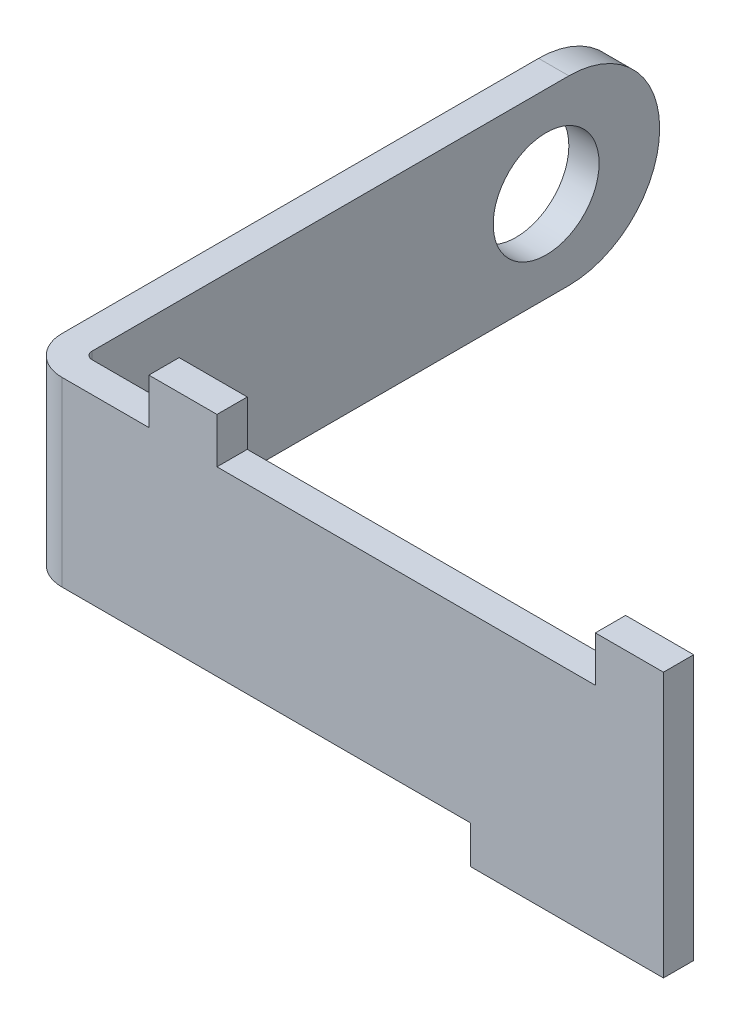
ISO-10303-21;
HEADER;
FILE_DESCRIPTION(('STEP AP214'),'2;1');
FILE_NAME('part.step','',(''),(''),'','','');
FILE_SCHEMA(('AUTOMOTIVE_DESIGN { 1 0 10303 214 1 1 1 1 }'));
ENDSEC;
DATA;
#1=APPLICATION_CONTEXT('core data for automotive mechanical design processes');
#2=APPLICATION_PROTOCOL_DEFINITION('international standard','automotive_design',2000,#1);
#3=PRODUCT_CONTEXT('',#1,'mechanical');
#4=PRODUCT('Part','Part','',(#3));
#5=PRODUCT_RELATED_PRODUCT_CATEGORY('part','',(#4));
#6=PRODUCT_DEFINITION_FORMATION('','',#4);
#7=PRODUCT_DEFINITION_CONTEXT('part definition',#1,'design');
#8=PRODUCT_DEFINITION('design','',#6,#7);
#9=PRODUCT_DEFINITION_SHAPE('','',#8);
#10=(LENGTH_UNIT() NAMED_UNIT(*) SI_UNIT(.MILLI.,.METRE.));
#11=(NAMED_UNIT(*) PLANE_ANGLE_UNIT() SI_UNIT($,.RADIAN.));
#12=(NAMED_UNIT(*) SI_UNIT($,.STERADIAN.) SOLID_ANGLE_UNIT());
#13=UNCERTAINTY_MEASURE_WITH_UNIT(LENGTH_MEASURE(1.E-05),#10,'distance_accuracy_value','');
#14=(GEOMETRIC_REPRESENTATION_CONTEXT(3) GLOBAL_UNCERTAINTY_ASSIGNED_CONTEXT((#13)) GLOBAL_UNIT_ASSIGNED_CONTEXT((#10,
#11,#12)) REPRESENTATION_CONTEXT('',''));
#15=CARTESIAN_POINT('',(0.,0.,0.));
#16=DIRECTION('',(0.,0.,1.));
#17=DIRECTION('',(1.,0.,0.));
#18=AXIS2_PLACEMENT_3D('',#15,#16,#17);
#19=CARTESIAN_POINT('',(-2.575,1.2,0.4));
#20=DIRECTION('',(0.,-1.,0.));
#21=DIRECTION('',(1.,0.,0.));
#22=AXIS2_PLACEMENT_3D('',#19,#20,#21);
#23=PLANE('',#22);
#24=DIRECTION('',(0.,0.,1.));
#25=VECTOR('',#24,1.);
#26=CARTESIAN_POINT('',(-2.575,1.2,0.4));
#27=LINE('',#26,#25);
#28=CARTESIAN_POINT('',(-2.575,1.2,0.));
#29=VERTEX_POINT('',#28);
#30=CARTESIAN_POINT('',(-2.575,1.2,0.4));
#31=VERTEX_POINT('',#30);
#32=EDGE_CURVE('E151',#29,#31,#27,.T.);
#33=ORIENTED_EDGE('',*,*,#32,.F.);
#34=DIRECTION('',(1.,0.,0.));
#35=VECTOR('',#34,1.);
#36=CARTESIAN_POINT('',(-2.575,1.2,0.));
#37=LINE('',#36,#35);
#38=CARTESIAN_POINT('',(-3.725,1.2,0.));
#39=VERTEX_POINT('',#38);
#40=EDGE_CURVE('E135',#39,#29,#37,.T.);
#41=ORIENTED_EDGE('',*,*,#40,.F.);
#42=CARTESIAN_POINT('',(-3.725,1.2,-0.1));
#43=DIRECTION('',(0.,1.,0.));
#44=DIRECTION('',(0.,0.,1.));
#45=AXIS2_PLACEMENT_3D('',#42,#43,#44);
#46=CIRCLE('',#45,0.1);
#47=CARTESIAN_POINT('',(-3.82499999999998,1.2,-0.1));
#48=VERTEX_POINT('',#47);
#49=EDGE_CURVE('E185',#39,#48,#46,.F.);
#50=ORIENTED_EDGE('',*,*,#49,.T.);
#51=DIRECTION('',(0.,0.,1.));
#52=VECTOR('',#51,1.);
#53=CARTESIAN_POINT('',(-3.825,1.2,-6.4));
#54=LINE('',#53,#52);
#55=CARTESIAN_POINT('',(-3.825,1.19999999999999,-6.4));
#56=VERTEX_POINT('',#55);
#57=EDGE_CURVE('E182',#48,#56,#54,.F.);
#58=ORIENTED_EDGE('',*,*,#57,.T.);
#59=DIRECTION('',(1.,0.,0.));
#60=VECTOR('',#59,1.);
#61=CARTESIAN_POINT('',(-4.225,1.19999999999999,-6.4));
#62=LINE('',#61,#60);
#63=CARTESIAN_POINT('',(-4.225,1.19999999999999,-6.4));
#64=VERTEX_POINT('',#63);
#65=EDGE_CURVE('E150',#64,#56,#62,.T.);
#66=ORIENTED_EDGE('',*,*,#65,.F.);
#67=DIRECTION('',(0.,0.,1.));
#68=VECTOR('',#67,1.);
#69=CARTESIAN_POINT('',(-4.225,1.2,-6.4));
#70=LINE('',#69,#68);
#71=CARTESIAN_POINT('',(-4.22499999999999,1.2,-0.0999999999999992));
#72=VERTEX_POINT('',#71);
#73=EDGE_CURVE('E132',#72,#64,#70,.F.);
#74=ORIENTED_EDGE('',*,*,#73,.F.);
#75=CARTESIAN_POINT('',(-3.725,1.2,-0.1));
#76=DIRECTION('',(0.,1.,0.));
#77=DIRECTION('',(0.,0.,1.));
#78=AXIS2_PLACEMENT_3D('',#75,#76,#77);
#79=CIRCLE('',#78,0.5);
#80=CARTESIAN_POINT('',(-3.725,1.2,0.4));
#81=VERTEX_POINT('',#80);
#82=EDGE_CURVE('E19',#81,#72,#79,.F.);
#83=ORIENTED_EDGE('',*,*,#82,.F.);
#84=DIRECTION('',(1.,0.,0.));
#85=VECTOR('',#84,1.);
#86=CARTESIAN_POINT('',(-2.575,1.2,0.4));
#87=LINE('',#86,#85);
#88=EDGE_CURVE('E128',#31,#81,#87,.F.);
#89=ORIENTED_EDGE('',*,*,#88,.F.);
#90=EDGE_LOOP('',(#33,#41,#50,#58,#66,#74,#83,#89));
#91=FACE_BOUND('',#90,.T.);
#92=ADVANCED_FACE('F16',(#91),#23,.F.);
#93=CARTESIAN_POINT('',(-4.225,0.,-6.4));
#94=DIRECTION('',(1.,0.,0.));
#95=DIRECTION('',(0.,0.,-1.));
#96=AXIS2_PLACEMENT_3D('',#93,#94,#95);
#97=CYLINDRICAL_SURFACE('',#96,1.2);
#98=CARTESIAN_POINT('',(-3.825,0.,-6.4));
#99=DIRECTION('',(1.,0.,0.));
#100=DIRECTION('',(0.,0.,-1.));
#101=AXIS2_PLACEMENT_3D('',#98,#99,#100);
#102=CIRCLE('',#101,1.2);
#103=CARTESIAN_POINT('',(-3.825,-1.20000000000001,-6.4));
#104=VERTEX_POINT('',#103);
#105=EDGE_CURVE('E179',#56,#104,#102,.F.);
#106=ORIENTED_EDGE('',*,*,#105,.T.);
#107=DIRECTION('',(1.,0.,0.));
#108=VECTOR('',#107,1.);
#109=CARTESIAN_POINT('',(-4.225,-1.20000000000001,-6.4));
#110=LINE('',#109,#108);
#111=CARTESIAN_POINT('',(-4.225,-1.20000000000001,-6.4));
#112=VERTEX_POINT('',#111);
#113=EDGE_CURVE('E154',#104,#112,#110,.F.);
#114=ORIENTED_EDGE('',*,*,#113,.T.);
#115=CARTESIAN_POINT('',(-4.225,0.,-6.4));
#116=DIRECTION('',(1.,0.,0.));
#117=DIRECTION('',(0.,0.,-1.));
#118=AXIS2_PLACEMENT_3D('',#115,#116,#117);
#119=CIRCLE('',#118,1.2);
#120=EDGE_CURVE('E173',#64,#112,#119,.F.);
#121=ORIENTED_EDGE('',*,*,#120,.F.);
#122=ORIENTED_EDGE('',*,*,#65,.T.);
#123=EDGE_LOOP('',(#106,#114,#121,#122));
#124=FACE_BOUND('',#123,.T.);
#125=ADVANCED_FACE('F374',(#124),#97,.T.);
#126=CARTESIAN_POINT('',(-4.225,0.,-6.1));
#127=DIRECTION('',(1.,0.,0.));
#128=DIRECTION('',(0.,0.,-1.));
#129=AXIS2_PLACEMENT_3D('',#126,#127,#128);
#130=CYLINDRICAL_SURFACE('',#129,0.7);
#131=CARTESIAN_POINT('',(-3.825,0.,-6.1));
#132=DIRECTION('',(1.,0.,0.));
#133=DIRECTION('',(0.,0.,-1.));
#134=AXIS2_PLACEMENT_3D('',#131,#132,#133);
#135=CIRCLE('',#134,0.7);
#136=CARTESIAN_POINT('',(-3.825,0.,-6.8));
#137=VERTEX_POINT('',#136);
#138=EDGE_CURVE('E176',#137,#137,#135,.T.);
#139=ORIENTED_EDGE('',*,*,#138,.T.);
#140=EDGE_LOOP('',(#139));
#141=FACE_BOUND('',#140,.T.);
#142=CARTESIAN_POINT('',(-4.225,0.,-6.1));
#143=DIRECTION('',(1.,0.,0.));
#144=DIRECTION('',(0.,0.,-1.));
#145=AXIS2_PLACEMENT_3D('',#142,#143,#144);
#146=CIRCLE('',#145,0.7);
#147=CARTESIAN_POINT('',(-4.225,0.,-6.8));
#148=VERTEX_POINT('',#147);
#149=EDGE_CURVE('E169',#148,#148,#146,.T.);
#150=ORIENTED_EDGE('',*,*,#149,.F.);
#151=EDGE_LOOP('',(#150));
#152=FACE_BOUND('',#151,.T.);
#153=ADVANCED_FACE('F512',(#141,#152),#130,.F.);
#154=CARTESIAN_POINT('',(-3.725,1.2,-0.1));
#155=DIRECTION('',(0.,1.,0.));
#156=DIRECTION('',(0.,0.,1.));
#157=AXIS2_PLACEMENT_3D('',#154,#155,#156);
#158=CYLINDRICAL_SURFACE('',#157,0.1);
#159=DIRECTION('',(0.,1.,0.));
#160=VECTOR('',#159,1.);
#161=CARTESIAN_POINT('',(-3.82499999999998,0.,-0.1));
#162=LINE('',#161,#160);
#163=CARTESIAN_POINT('',(-3.82499999999999,-1.2,-0.1));
#164=VERTEX_POINT('',#163);
#165=EDGE_CURVE('E184',#164,#48,#162,.T.);
#166=ORIENTED_EDGE('',*,*,#165,.T.);
#167=ORIENTED_EDGE('',*,*,#49,.F.);
#168=DIRECTION('',(0.,1.,0.));
#169=VECTOR('',#168,1.);
#170=CARTESIAN_POINT('',(-3.725,-1.2,0.));
#171=LINE('',#170,#169);
#172=CARTESIAN_POINT('',(-3.725,-1.2,0.));
#173=VERTEX_POINT('',#172);
#174=EDGE_CURVE('E172',#173,#39,#171,.T.);
#175=ORIENTED_EDGE('',*,*,#174,.F.);
#176=CARTESIAN_POINT('',(-3.725,-1.2,-0.1));
#177=DIRECTION('',(0.,1.,0.));
#178=DIRECTION('',(0.,0.,1.));
#179=AXIS2_PLACEMENT_3D('',#176,#177,#178);
#180=CIRCLE('',#179,0.1);
#181=EDGE_CURVE('E183',#164,#173,#180,.T.);
#182=ORIENTED_EDGE('',*,*,#181,.F.);
#183=EDGE_LOOP('',(#166,#167,#175,#182));
#184=FACE_BOUND('',#183,.T.);
#185=ADVANCED_FACE('F369',(#184),#158,.F.);
#186=CARTESIAN_POINT('',(-3.825,0.,-6.4));
#187=DIRECTION('',(-1.,0.,0.));
#188=DIRECTION('',(0.,0.,1.));
#189=AXIS2_PLACEMENT_3D('',#186,#187,#188);
#190=PLANE('',#189);
#191=ORIENTED_EDGE('',*,*,#138,.F.);
#192=EDGE_LOOP('',(#191));
#193=FACE_BOUND('',#192,.T.);
#194=ORIENTED_EDGE('',*,*,#105,.F.);
#195=ORIENTED_EDGE('',*,*,#57,.F.);
#196=ORIENTED_EDGE('',*,*,#165,.F.);
#197=DIRECTION('',(0.,0.,1.));
#198=VECTOR('',#197,1.);
#199=CARTESIAN_POINT('',(-3.825,-1.2,0.4));
#200=LINE('',#199,#198);
#201=EDGE_CURVE('E321',#164,#104,#200,.F.);
#202=ORIENTED_EDGE('',*,*,#201,.T.);
#203=EDGE_LOOP('',(#194,#195,#196,#202));
#204=FACE_BOUND('',#203,.T.);
#205=ADVANCED_FACE('F372',(#193,#204),#190,.F.);
#206=CARTESIAN_POINT('',(-4.225,0.,-6.4));
#207=DIRECTION('',(-1.,0.,0.));
#208=DIRECTION('',(0.,0.,1.));
#209=AXIS2_PLACEMENT_3D('',#206,#207,#208);
#210=PLANE('',#209);
#211=ORIENTED_EDGE('',*,*,#149,.T.);
#212=EDGE_LOOP('',(#211));
#213=FACE_BOUND('',#212,.T.);
#214=DIRECTION('',(0.,0.,1.));
#215=VECTOR('',#214,1.);
#216=CARTESIAN_POINT('',(-4.225,-1.2,0.4));
#217=LINE('',#216,#215);
#218=CARTESIAN_POINT('',(-4.225,-1.2,-0.1));
#219=VERTEX_POINT('',#218);
#220=EDGE_CURVE('E168',#112,#219,#217,.T.);
#221=ORIENTED_EDGE('',*,*,#220,.T.);
#222=DIRECTION('',(0.,1.,0.));
#223=VECTOR('',#222,1.);
#224=CARTESIAN_POINT('',(-4.225,1.2,-0.1));
#225=LINE('',#224,#223);
#226=EDGE_CURVE('E197',#72,#219,#225,.F.);
#227=ORIENTED_EDGE('',*,*,#226,.F.);
#228=ORIENTED_EDGE('',*,*,#73,.T.);
#229=ORIENTED_EDGE('',*,*,#120,.T.);
#230=EDGE_LOOP('',(#221,#227,#228,#229));
#231=FACE_BOUND('',#230,.T.);
#232=ADVANCED_FACE('F376',(#213,#231),#210,.T.);
#233=CARTESIAN_POINT('',(1.675,-1.2,0.));
#234=DIRECTION('',(0.,0.,-1.));
#235=DIRECTION('',(-1.,0.,0.));
#236=AXIS2_PLACEMENT_3D('',#233,#234,#235);
#237=PLANE('',#236);
#238=DIRECTION('',(1.,0.,0.));
#239=VECTOR('',#238,1.);
#240=CARTESIAN_POINT('',(3.325,1.8,0.));
#241=LINE('',#240,#239);
#242=CARTESIAN_POINT('',(3.325,1.8,0.));
#243=VERTEX_POINT('',#242);
#244=CARTESIAN_POINT('',(4.225,1.8,0.));
#245=VERTEX_POINT('',#244);
#246=EDGE_CURVE('E223',#243,#245,#241,.T.);
#247=ORIENTED_EDGE('',*,*,#246,.T.);
#248=DIRECTION('',(0.,1.,0.));
#249=VECTOR('',#248,1.);
#250=CARTESIAN_POINT('',(4.225,1.8,0.));
#251=LINE('',#250,#249);
#252=CARTESIAN_POINT('',(4.225,-1.7,0.));
#253=VERTEX_POINT('',#252);
#254=EDGE_CURVE('E229',#245,#253,#251,.F.);
#255=ORIENTED_EDGE('',*,*,#254,.T.);
#256=DIRECTION('',(1.,0.,0.));
#257=VECTOR('',#256,1.);
#258=CARTESIAN_POINT('',(1.675,-1.7,0.));
#259=LINE('',#258,#257);
#260=CARTESIAN_POINT('',(1.675,-1.7,0.));
#261=VERTEX_POINT('',#260);
#262=EDGE_CURVE('E235',#253,#261,#259,.F.);
#263=ORIENTED_EDGE('',*,*,#262,.T.);
#264=DIRECTION('',(0.,1.,0.));
#265=VECTOR('',#264,1.);
#266=CARTESIAN_POINT('',(1.675,-1.2,0.));
#267=LINE('',#266,#265);
#268=CARTESIAN_POINT('',(1.675,-1.2,0.));
#269=VERTEX_POINT('',#268);
#270=EDGE_CURVE('E246',#261,#269,#267,.T.);
#271=ORIENTED_EDGE('',*,*,#270,.T.);
#272=DIRECTION('',(-1.,0.,0.));
#273=VECTOR('',#272,1.);
#274=CARTESIAN_POINT('',(-4.225,-1.2,0.));
#275=LINE('',#274,#273);
#276=EDGE_CURVE('E143',#269,#173,#275,.T.);
#277=ORIENTED_EDGE('',*,*,#276,.T.);
#278=ORIENTED_EDGE('',*,*,#174,.T.);
#279=ORIENTED_EDGE('',*,*,#40,.T.);
#280=DIRECTION('',(0.,1.,0.));
#281=VECTOR('',#280,1.);
#282=CARTESIAN_POINT('',(-2.575,1.2,0.));
#283=LINE('',#282,#281);
#284=CARTESIAN_POINT('',(-2.575,1.8,0.));
#285=VERTEX_POINT('',#284);
#286=EDGE_CURVE('E193',#29,#285,#283,.T.);
#287=ORIENTED_EDGE('',*,*,#286,.T.);
#288=DIRECTION('',(1.,0.,0.));
#289=VECTOR('',#288,1.);
#290=CARTESIAN_POINT('',(-2.575,1.8,0.));
#291=LINE('',#290,#289);
#292=CARTESIAN_POINT('',(-1.675,1.8,0.));
#293=VERTEX_POINT('',#292);
#294=EDGE_CURVE('E196',#285,#293,#291,.T.);
#295=ORIENTED_EDGE('',*,*,#294,.T.);
#296=DIRECTION('',(0.,1.,0.));
#297=VECTOR('',#296,1.);
#298=CARTESIAN_POINT('',(-1.675,1.2,0.));
#299=LINE('',#298,#297);
#300=CARTESIAN_POINT('',(-1.675,1.2,0.));
#301=VERTEX_POINT('',#300);
#302=EDGE_CURVE('E205',#293,#301,#299,.F.);
#303=ORIENTED_EDGE('',*,*,#302,.T.);
#304=DIRECTION('',(1.,0.,0.));
#305=VECTOR('',#304,1.);
#306=CARTESIAN_POINT('',(-1.675,1.2,0.));
#307=LINE('',#306,#305);
#308=CARTESIAN_POINT('',(3.325,1.2,0.));
#309=VERTEX_POINT('',#308);
#310=EDGE_CURVE('E211',#301,#309,#307,.T.);
#311=ORIENTED_EDGE('',*,*,#310,.T.);
#312=DIRECTION('',(0.,1.,0.));
#313=VECTOR('',#312,1.);
#314=CARTESIAN_POINT('',(3.325,1.2,0.));
#315=LINE('',#314,#313);
#316=EDGE_CURVE('E217',#309,#243,#315,.T.);
#317=ORIENTED_EDGE('',*,*,#316,.T.);
#318=EDGE_LOOP('',(#247,#255,#263,#271,#277,#278,#279,#287,#295,#303,#311,#317));
#319=FACE_BOUND('',#318,.T.);
#320=ADVANCED_FACE('F339',(#319),#237,.T.);
#321=CARTESIAN_POINT('',(-3.725,1.2,-0.1));
#322=DIRECTION('',(0.,1.,0.));
#323=DIRECTION('',(0.,0.,1.));
#324=AXIS2_PLACEMENT_3D('',#321,#322,#323);
#325=CYLINDRICAL_SURFACE('',#324,0.5);
#326=DIRECTION('',(0.,1.,0.));
#327=VECTOR('',#326,1.);
#328=CARTESIAN_POINT('',(-3.725,-1.2,0.4));
#329=LINE('',#328,#327);
#330=CARTESIAN_POINT('',(-3.725,-1.2,0.4));
#331=VERTEX_POINT('',#330);
#332=EDGE_CURVE('E137',#331,#81,#329,.T.);
#333=ORIENTED_EDGE('',*,*,#332,.T.);
#334=ORIENTED_EDGE('',*,*,#82,.T.);
#335=ORIENTED_EDGE('',*,*,#226,.T.);
#336=CARTESIAN_POINT('',(-3.725,-1.2,-0.1));
#337=DIRECTION('',(0.,1.,0.));
#338=DIRECTION('',(0.,0.,1.));
#339=AXIS2_PLACEMENT_3D('',#336,#337,#338);
#340=CIRCLE('',#339,0.5);
#341=EDGE_CURVE('E140',#219,#331,#340,.T.);
#342=ORIENTED_EDGE('',*,*,#341,.T.);
#343=EDGE_LOOP('',(#333,#334,#335,#342));
#344=FACE_BOUND('',#343,.T.);
#345=ADVANCED_FACE('F138',(#344),#325,.T.);
#346=CARTESIAN_POINT('',(-2.575,1.2,0.4));
#347=DIRECTION('',(1.,0.,0.));
#348=DIRECTION('',(0.,0.,-1.));
#349=AXIS2_PLACEMENT_3D('',#346,#347,#348);
#350=PLANE('',#349);
#351=DIRECTION('',(0.,1.,0.));
#352=VECTOR('',#351,1.);
#353=CARTESIAN_POINT('',(-2.575,-1.2,0.4));
#354=LINE('',#353,#352);
#355=CARTESIAN_POINT('',(-2.575,1.8,0.4));
#356=VERTEX_POINT('',#355);
#357=EDGE_CURVE('E142',#31,#356,#354,.T.);
#358=ORIENTED_EDGE('',*,*,#357,.T.);
#359=DIRECTION('',(0.,0.,-1.));
#360=VECTOR('',#359,1.);
#361=CARTESIAN_POINT('',(-2.575,1.8,0.4));
#362=LINE('',#361,#360);
#363=EDGE_CURVE('E202',#356,#285,#362,.T.);
#364=ORIENTED_EDGE('',*,*,#363,.T.);
#365=ORIENTED_EDGE('',*,*,#286,.F.);
#366=ORIENTED_EDGE('',*,*,#32,.T.);
#367=EDGE_LOOP('',(#358,#364,#365,#366));
#368=FACE_BOUND('',#367,.T.);
#369=ADVANCED_FACE('F367',(#368),#350,.F.);
#370=CARTESIAN_POINT('',(-2.575,1.8,0.4));
#371=DIRECTION('',(0.,-1.,0.));
#372=DIRECTION('',(0.,0.,-1.));
#373=AXIS2_PLACEMENT_3D('',#370,#371,#372);
#374=PLANE('',#373);
#375=DIRECTION('',(-1.,0.,0.));
#376=VECTOR('',#375,1.);
#377=CARTESIAN_POINT('',(1.675,1.8,0.4));
#378=LINE('',#377,#376);
#379=CARTESIAN_POINT('',(-1.675,1.8,0.4));
#380=VERTEX_POINT('',#379);
#381=EDGE_CURVE('E254',#356,#380,#378,.F.);
#382=ORIENTED_EDGE('',*,*,#381,.T.);
#383=DIRECTION('',(0.,0.,1.));
#384=VECTOR('',#383,1.);
#385=CARTESIAN_POINT('',(-1.675,1.8,0.4));
#386=LINE('',#385,#384);
#387=EDGE_CURVE('E208',#380,#293,#386,.F.);
#388=ORIENTED_EDGE('',*,*,#387,.T.);
#389=ORIENTED_EDGE('',*,*,#294,.F.);
#390=ORIENTED_EDGE('',*,*,#363,.F.);
#391=EDGE_LOOP('',(#382,#388,#389,#390));
#392=FACE_BOUND('',#391,.T.);
#393=ADVANCED_FACE('F364',(#392),#374,.F.);
#394=CARTESIAN_POINT('',(-1.675,1.2,0.4));
#395=DIRECTION('',(-1.,0.,0.));
#396=DIRECTION('',(0.,0.,1.));
#397=AXIS2_PLACEMENT_3D('',#394,#395,#396);
#398=PLANE('',#397);
#399=DIRECTION('',(0.,1.,0.));
#400=VECTOR('',#399,1.);
#401=CARTESIAN_POINT('',(-1.675,-1.2,0.4));
#402=LINE('',#401,#400);
#403=CARTESIAN_POINT('',(-1.675,1.2,0.4));
#404=VERTEX_POINT('',#403);
#405=EDGE_CURVE('E263',#380,#404,#402,.F.);
#406=ORIENTED_EDGE('',*,*,#405,.T.);
#407=DIRECTION('',(0.,0.,-1.));
#408=VECTOR('',#407,1.);
#409=CARTESIAN_POINT('',(-1.675,1.2,0.4));
#410=LINE('',#409,#408);
#411=EDGE_CURVE('E214',#404,#301,#410,.T.);
#412=ORIENTED_EDGE('',*,*,#411,.T.);
#413=ORIENTED_EDGE('',*,*,#302,.F.);
#414=ORIENTED_EDGE('',*,*,#387,.F.);
#415=EDGE_LOOP('',(#406,#412,#413,#414));
#416=FACE_BOUND('',#415,.T.);
#417=ADVANCED_FACE('F362',(#416),#398,.F.);
#418=CARTESIAN_POINT('',(-1.675,1.2,0.4));
#419=DIRECTION('',(0.,-1.,0.));
#420=DIRECTION('',(0.,0.,-1.));
#421=AXIS2_PLACEMENT_3D('',#418,#419,#420);
#422=PLANE('',#421);
#423=DIRECTION('',(-1.,0.,0.));
#424=VECTOR('',#423,1.);
#425=CARTESIAN_POINT('',(1.675,1.2,0.4));
#426=LINE('',#425,#424);
#427=CARTESIAN_POINT('',(3.325,1.2,0.4));
#428=VERTEX_POINT('',#427);
#429=EDGE_CURVE('E272',#404,#428,#426,.F.);
#430=ORIENTED_EDGE('',*,*,#429,.T.);
#431=DIRECTION('',(0.,0.,-1.));
#432=VECTOR('',#431,1.);
#433=CARTESIAN_POINT('',(3.325,1.2,0.4));
#434=LINE('',#433,#432);
#435=EDGE_CURVE('E220',#428,#309,#434,.T.);
#436=ORIENTED_EDGE('',*,*,#435,.T.);
#437=ORIENTED_EDGE('',*,*,#310,.F.);
#438=ORIENTED_EDGE('',*,*,#411,.F.);
#439=EDGE_LOOP('',(#430,#436,#437,#438));
#440=FACE_BOUND('',#439,.T.);
#441=ADVANCED_FACE('F360',(#440),#422,.F.);
#442=CARTESIAN_POINT('',(3.325,1.2,0.4));
#443=DIRECTION('',(1.,0.,0.));
#444=DIRECTION('',(0.,0.,-1.));
#445=AXIS2_PLACEMENT_3D('',#442,#443,#444);
#446=PLANE('',#445);
#447=DIRECTION('',(0.,1.,0.));
#448=VECTOR('',#447,1.);
#449=CARTESIAN_POINT('',(3.325,-1.2,0.4));
#450=LINE('',#449,#448);
#451=CARTESIAN_POINT('',(3.325,1.8,0.4));
#452=VERTEX_POINT('',#451);
#453=EDGE_CURVE('E281',#428,#452,#450,.T.);
#454=ORIENTED_EDGE('',*,*,#453,.T.);
#455=DIRECTION('',(0.,0.,-1.));
#456=VECTOR('',#455,1.);
#457=CARTESIAN_POINT('',(3.325,1.8,0.4));
#458=LINE('',#457,#456);
#459=EDGE_CURVE('E226',#452,#243,#458,.T.);
#460=ORIENTED_EDGE('',*,*,#459,.T.);
#461=ORIENTED_EDGE('',*,*,#316,.F.);
#462=ORIENTED_EDGE('',*,*,#435,.F.);
#463=EDGE_LOOP('',(#454,#460,#461,#462));
#464=FACE_BOUND('',#463,.T.);
#465=ADVANCED_FACE('F356',(#464),#446,.F.);
#466=CARTESIAN_POINT('',(3.325,1.8,0.4));
#467=DIRECTION('',(0.,-1.,0.));
#468=DIRECTION('',(0.,0.,-1.));
#469=AXIS2_PLACEMENT_3D('',#466,#467,#468);
#470=PLANE('',#469);
#471=DIRECTION('',(-1.,0.,0.));
#472=VECTOR('',#471,1.);
#473=CARTESIAN_POINT('',(1.675,1.8,0.4));
#474=LINE('',#473,#472);
#475=CARTESIAN_POINT('',(4.225,1.8,0.4));
#476=VERTEX_POINT('',#475);
#477=EDGE_CURVE('E290',#452,#476,#474,.F.);
#478=ORIENTED_EDGE('',*,*,#477,.T.);
#479=DIRECTION('',(0.,0.,1.));
#480=VECTOR('',#479,1.);
#481=CARTESIAN_POINT('',(4.225,1.8,0.4));
#482=LINE('',#481,#480);
#483=EDGE_CURVE('E232',#476,#245,#482,.F.);
#484=ORIENTED_EDGE('',*,*,#483,.T.);
#485=ORIENTED_EDGE('',*,*,#246,.F.);
#486=ORIENTED_EDGE('',*,*,#459,.F.);
#487=EDGE_LOOP('',(#478,#484,#485,#486));
#488=FACE_BOUND('',#487,.T.);
#489=ADVANCED_FACE('F354',(#488),#470,.F.);
#490=CARTESIAN_POINT('',(4.225,1.8,0.4));
#491=DIRECTION('',(-1.,0.,0.));
#492=DIRECTION('',(0.,0.,1.));
#493=AXIS2_PLACEMENT_3D('',#490,#491,#492);
#494=PLANE('',#493);
#495=DIRECTION('',(0.,1.,0.));
#496=VECTOR('',#495,1.);
#497=CARTESIAN_POINT('',(4.225,-1.2,0.4));
#498=LINE('',#497,#496);
#499=CARTESIAN_POINT('',(4.225,-1.7,0.4));
#500=VERTEX_POINT('',#499);
#501=EDGE_CURVE('E299',#476,#500,#498,.F.);
#502=ORIENTED_EDGE('',*,*,#501,.T.);
#503=DIRECTION('',(0.,0.,1.));
#504=VECTOR('',#503,1.);
#505=CARTESIAN_POINT('',(4.225,-1.7,0.4));
#506=LINE('',#505,#504);
#507=EDGE_CURVE('E238',#500,#253,#506,.F.);
#508=ORIENTED_EDGE('',*,*,#507,.T.);
#509=ORIENTED_EDGE('',*,*,#254,.F.);
#510=ORIENTED_EDGE('',*,*,#483,.F.);
#511=EDGE_LOOP('',(#502,#508,#509,#510));
#512=FACE_BOUND('',#511,.T.);
#513=ADVANCED_FACE('F350',(#512),#494,.F.);
#514=CARTESIAN_POINT('',(1.675,-1.7,0.4));
#515=DIRECTION('',(0.,1.,0.));
#516=DIRECTION('',(0.,0.,1.));
#517=AXIS2_PLACEMENT_3D('',#514,#515,#516);
#518=PLANE('',#517);
#519=DIRECTION('',(-1.,0.,0.));
#520=VECTOR('',#519,1.);
#521=CARTESIAN_POINT('',(1.675,-1.7,0.4));
#522=LINE('',#521,#520);
#523=CARTESIAN_POINT('',(1.675,-1.7,0.4));
#524=VERTEX_POINT('',#523);
#525=EDGE_CURVE('E308',#500,#524,#522,.T.);
#526=ORIENTED_EDGE('',*,*,#525,.T.);
#527=DIRECTION('',(0.,0.,-1.));
#528=VECTOR('',#527,1.);
#529=CARTESIAN_POINT('',(1.675,-1.7,0.4));
#530=LINE('',#529,#528);
#531=EDGE_CURVE('E248',#524,#261,#530,.T.);
#532=ORIENTED_EDGE('',*,*,#531,.T.);
#533=ORIENTED_EDGE('',*,*,#262,.F.);
#534=ORIENTED_EDGE('',*,*,#507,.F.);
#535=EDGE_LOOP('',(#526,#532,#533,#534));
#536=FACE_BOUND('',#535,.T.);
#537=ADVANCED_FACE('F348',(#536),#518,.F.);
#538=CARTESIAN_POINT('',(1.675,-1.2,0.4));
#539=DIRECTION('',(1.,0.,0.));
#540=DIRECTION('',(0.,0.,-1.));
#541=AXIS2_PLACEMENT_3D('',#538,#539,#540);
#542=PLANE('',#541);
#543=DIRECTION('',(0.,1.,0.));
#544=VECTOR('',#543,1.);
#545=CARTESIAN_POINT('',(1.675,-1.2,0.4));
#546=LINE('',#545,#544);
#547=CARTESIAN_POINT('',(1.675,-1.2,0.4));
#548=VERTEX_POINT('',#547);
#549=EDGE_CURVE('E25',#524,#548,#546,.T.);
#550=ORIENTED_EDGE('',*,*,#549,.T.);
#551=DIRECTION('',(0.,0.,1.));
#552=VECTOR('',#551,1.);
#553=CARTESIAN_POINT('',(1.675,-1.2,0.4));
#554=LINE('',#553,#552);
#555=EDGE_CURVE('E33',#548,#269,#554,.F.);
#556=ORIENTED_EDGE('',*,*,#555,.T.);
#557=ORIENTED_EDGE('',*,*,#270,.F.);
#558=ORIENTED_EDGE('',*,*,#531,.F.);
#559=EDGE_LOOP('',(#550,#556,#557,#558));
#560=FACE_BOUND('',#559,.T.);
#561=ADVANCED_FACE('F344',(#560),#542,.F.);
#562=CARTESIAN_POINT('',(-4.225,-1.2,0.4));
#563=DIRECTION('',(0.,1.,0.));
#564=DIRECTION('',(-1.,0.,0.));
#565=AXIS2_PLACEMENT_3D('',#562,#563,#564);
#566=PLANE('',#565);
#567=ORIENTED_EDGE('',*,*,#555,.F.);
#568=DIRECTION('',(-1.,0.,0.));
#569=VECTOR('',#568,1.);
#570=CARTESIAN_POINT('',(1.675,-1.2,0.4));
#571=LINE('',#570,#569);
#572=EDGE_CURVE('E11',#548,#331,#571,.T.);
#573=ORIENTED_EDGE('',*,*,#572,.T.);
#574=ORIENTED_EDGE('',*,*,#341,.F.);
#575=ORIENTED_EDGE('',*,*,#220,.F.);
#576=ORIENTED_EDGE('',*,*,#113,.F.);
#577=ORIENTED_EDGE('',*,*,#201,.F.);
#578=ORIENTED_EDGE('',*,*,#181,.T.);
#579=ORIENTED_EDGE('',*,*,#276,.F.);
#580=EDGE_LOOP('',(#567,#573,#574,#575,#576,#577,#578,#579));
#581=FACE_BOUND('',#580,.T.);
#582=ADVANCED_FACE('F341',(#581),#566,.F.);
#583=CARTESIAN_POINT('',(1.675,-1.2,0.4));
#584=DIRECTION('',(0.,0.,-1.));
#585=DIRECTION('',(-1.,0.,0.));
#586=AXIS2_PLACEMENT_3D('',#583,#584,#585);
#587=PLANE('',#586);
#588=ORIENTED_EDGE('',*,*,#549,.F.);
#589=ORIENTED_EDGE('',*,*,#525,.F.);
#590=ORIENTED_EDGE('',*,*,#501,.F.);
#591=ORIENTED_EDGE('',*,*,#477,.F.);
#592=ORIENTED_EDGE('',*,*,#453,.F.);
#593=ORIENTED_EDGE('',*,*,#429,.F.);
#594=ORIENTED_EDGE('',*,*,#405,.F.);
#595=ORIENTED_EDGE('',*,*,#381,.F.);
#596=ORIENTED_EDGE('',*,*,#357,.F.);
#597=ORIENTED_EDGE('',*,*,#88,.T.);
#598=ORIENTED_EDGE('',*,*,#332,.F.);
#599=ORIENTED_EDGE('',*,*,#572,.F.);
#600=EDGE_LOOP('',(#588,#589,#590,#591,#592,#593,#594,#595,#596,#597,#598,#599));
#601=FACE_BOUND('',#600,.T.);
#602=ADVANCED_FACE('F146',(#601),#587,.F.);
#603=CLOSED_SHELL('',(#92,#125,#153,#185,#205,#232,#320,#345,#369,#393,#417,#441,#465,#489,#513,
#537,#561,#582,#602));
#604=MANIFOLD_SOLID_BREP('B1',#603);
#605=ADVANCED_BREP_SHAPE_REPRESENTATION('',(#18,#604),#14);
#606=SHAPE_DEFINITION_REPRESENTATION(#9,#605);
ENDSEC;
END-ISO-10303-21;
